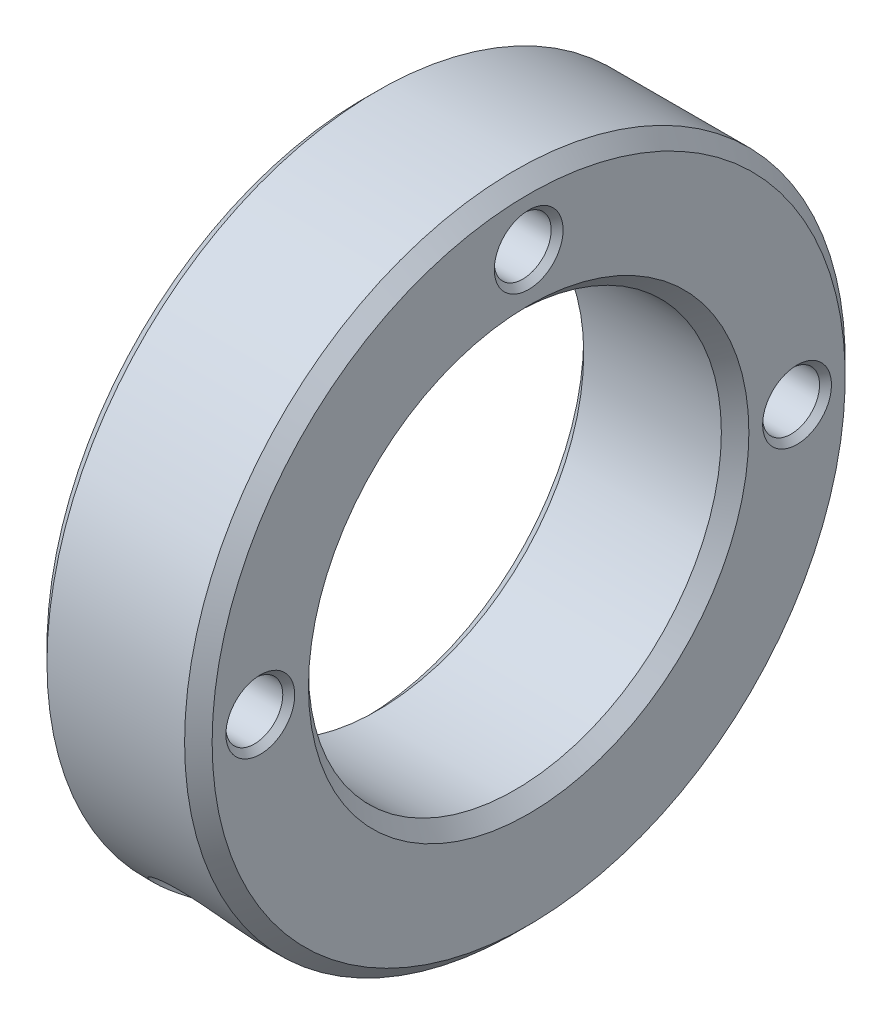
ISO-10303-21;
HEADER;
FILE_DESCRIPTION(('STEP AP214'),'2;1');
FILE_NAME('part.step','',(''),(''),'','','');
FILE_SCHEMA(('AUTOMOTIVE_DESIGN { 1 0 10303 214 1 1 1 1 }'));
ENDSEC;
DATA;
#1=APPLICATION_CONTEXT('core data for automotive mechanical design processes');
#2=APPLICATION_PROTOCOL_DEFINITION('international standard','automotive_design',2000,#1);
#3=PRODUCT_CONTEXT('',#1,'mechanical');
#4=PRODUCT('Part','Part','',(#3));
#5=PRODUCT_RELATED_PRODUCT_CATEGORY('part','',(#4));
#6=PRODUCT_DEFINITION_FORMATION('','',#4);
#7=PRODUCT_DEFINITION_CONTEXT('part definition',#1,'design');
#8=PRODUCT_DEFINITION('design','',#6,#7);
#9=PRODUCT_DEFINITION_SHAPE('','',#8);
#10=(LENGTH_UNIT() NAMED_UNIT(*) SI_UNIT(.MILLI.,.METRE.));
#11=(NAMED_UNIT(*) PLANE_ANGLE_UNIT() SI_UNIT($,.RADIAN.));
#12=(NAMED_UNIT(*) SI_UNIT($,.STERADIAN.) SOLID_ANGLE_UNIT());
#13=UNCERTAINTY_MEASURE_WITH_UNIT(LENGTH_MEASURE(1.E-05),#10,'distance_accuracy_value','');
#14=(GEOMETRIC_REPRESENTATION_CONTEXT(3) GLOBAL_UNCERTAINTY_ASSIGNED_CONTEXT((#13)) GLOBAL_UNIT_ASSIGNED_CONTEXT((#10,
#11,#12)) REPRESENTATION_CONTEXT('',''));
#15=CARTESIAN_POINT('',(0.,0.,0.));
#16=DIRECTION('',(0.,0.,1.));
#17=DIRECTION('',(1.,0.,0.));
#18=AXIS2_PLACEMENT_3D('',#15,#16,#17);
#19=CARTESIAN_POINT('',(0.,-18.5,-24.));
#20=DIRECTION('',(0.,0.,1.));
#21=DIRECTION('',(1.,0.,0.));
#22=AXIS2_PLACEMENT_3D('',#19,#20,#21);
#23=CYLINDRICAL_SURFACE('',#22,2.067);
#24=CARTESIAN_POINT('',(0.,-18.5,2.5));
#25=DIRECTION('',(0.,0.,1.));
#26=DIRECTION('',(1.,0.,0.));
#27=AXIS2_PLACEMENT_3D('',#24,#25,#26);
#28=CIRCLE('',#27,2.067);
#29=CARTESIAN_POINT('',(2.067,-18.5,2.5));
#30=VERTEX_POINT('',#29);
#31=EDGE_CURVE('E20',#30,#30,#28,.F.);
#32=ORIENTED_EDGE('',*,*,#31,.F.);
#33=EDGE_LOOP('',(#32));
#34=FACE_BOUND('',#33,.T.);
#35=CARTESIAN_POINT('',(0.,-18.5,-13.983));
#36=DIRECTION('',(0.,0.,1.));
#37=DIRECTION('',(1.,0.,0.));
#38=AXIS2_PLACEMENT_3D('',#35,#36,#37);
#39=CIRCLE('',#38,2.067);
#40=CARTESIAN_POINT('',(2.067,-18.5,-13.983));
#41=VERTEX_POINT('',#40);
#42=EDGE_CURVE('E237',#41,#41,#39,.F.);
#43=ORIENTED_EDGE('',*,*,#42,.T.);
#44=EDGE_LOOP('',(#43));
#45=FACE_BOUND('',#44,.T.);
#46=ADVANCED_FACE('F17',(#34,#45),#23,.F.);
#47=CARTESIAN_POINT('',(0.,-15.75,2.5));
#48=DIRECTION('',(0.,0.,1.));
#49=DIRECTION('',(1.,0.,0.));
#50=AXIS2_PLACEMENT_3D('',#47,#48,#49);
#51=PLANE('',#50);
#52=ORIENTED_EDGE('',*,*,#31,.T.);
#53=EDGE_LOOP('',(#52));
#54=FACE_BOUND('',#53,.T.);
#55=CARTESIAN_POINT('',(0.,-18.5,2.5));
#56=DIRECTION('',(0.,0.,1.));
#57=DIRECTION('',(1.,0.,0.));
#58=AXIS2_PLACEMENT_3D('',#55,#56,#57);
#59=CIRCLE('',#58,2.75);
#60=CARTESIAN_POINT('',(2.75,-18.5,2.5));
#61=VERTEX_POINT('',#60);
#62=EDGE_CURVE('E235',#61,#61,#59,.T.);
#63=ORIENTED_EDGE('',*,*,#62,.T.);
#64=EDGE_LOOP('',(#63));
#65=FACE_BOUND('',#64,.T.);
#66=ADVANCED_FACE('F244',(#54,#65),#51,.T.);
#67=CARTESIAN_POINT('',(-4.5,-17.5,-13.983));
#68=DIRECTION('',(0.,0.,1.));
#69=DIRECTION('',(1.,0.,0.));
#70=AXIS2_PLACEMENT_3D('',#67,#68,#69);
#71=PLANE('',#70);
#72=ORIENTED_EDGE('',*,*,#42,.F.);
#73=EDGE_LOOP('',(#72));
#74=FACE_BOUND('',#73,.T.);
#75=CARTESIAN_POINT('',(0.,-17.5,-13.983));
#76=DIRECTION('',(0.,0.,1.));
#77=DIRECTION('',(1.,0.,0.));
#78=AXIS2_PLACEMENT_3D('',#75,#76,#77);
#79=CIRCLE('',#78,4.5);
#80=CARTESIAN_POINT('',(-4.02825273579107,-19.5057866029545,-13.983));
#81=VERTEX_POINT('',#80);
#82=CARTESIAN_POINT('',(4.02825273579106,-19.5057866029545,-13.983));
#83=VERTEX_POINT('',#82);
#84=EDGE_CURVE('E43',#81,#83,#79,.F.);
#85=ORIENTED_EDGE('',*,*,#84,.T.);
#86=CARTESIAN_POINT('',(0.,-17.5,-13.983));
#87=DIRECTION('',(0.,0.,1.));
#88=DIRECTION('',(1.,0.,0.));
#89=AXIS2_PLACEMENT_3D('',#86,#87,#88);
#90=CIRCLE('',#89,4.5);
#91=EDGE_CURVE('E49',#81,#83,#90,.T.);
#92=ORIENTED_EDGE('',*,*,#91,.F.);
#93=EDGE_LOOP('',(#85,#92));
#94=FACE_BOUND('',#93,.T.);
#95=ADVANCED_FACE('F56',(#74,#94),#71,.F.);
#96=CARTESIAN_POINT('',(0.,-18.5,-24.));
#97=DIRECTION('',(0.,0.,1.));
#98=DIRECTION('',(1.,0.,0.));
#99=AXIS2_PLACEMENT_3D('',#96,#97,#98);
#100=CYLINDRICAL_SURFACE('',#99,2.75);
#101=CARTESIAN_POINT('',(0.,-18.5,8.));
#102=DIRECTION('',(0.,0.,1.));
#103=DIRECTION('',(1.,0.,0.));
#104=AXIS2_PLACEMENT_3D('',#101,#102,#103);
#105=CIRCLE('',#104,2.75);
#106=CARTESIAN_POINT('',(2.75,-18.5,8.));
#107=VERTEX_POINT('',#106);
#108=EDGE_CURVE('E229',#107,#107,#105,.F.);
#109=ORIENTED_EDGE('',*,*,#108,.F.);
#110=EDGE_LOOP('',(#109));
#111=FACE_BOUND('',#110,.T.);
#112=ORIENTED_EDGE('',*,*,#62,.F.);
#113=EDGE_LOOP('',(#112));
#114=FACE_BOUND('',#113,.T.);
#115=ADVANCED_FACE('F254',(#111,#114),#100,.F.);
#116=CARTESIAN_POINT('',(-6.,0.,0.));
#117=DIRECTION('',(1.,0.,0.));
#118=DIRECTION('',(0.,0.,-1.));
#119=AXIS2_PLACEMENT_3D('',#116,#117,#118);
#120=PLANE('',#119);
#121=CARTESIAN_POINT('',(-6.00000000002865,0.,0.));
#122=DIRECTION('',(-1.,0.,0.));
#123=DIRECTION('',(0.,0.,1.));
#124=AXIS2_PLACEMENT_3D('',#121,#122,#123);
#125=CIRCLE('',#124,16.0000000000196);
#126=CARTESIAN_POINT('',(-6.00000000002865,0.,16.0000000000196));
#127=VERTEX_POINT('',#126);
#128=EDGE_CURVE('E224',#127,#127,#125,.F.);
#129=ORIENTED_EDGE('',*,*,#128,.T.);
#130=EDGE_LOOP('',(#129));
#131=FACE_BOUND('',#130,.T.);
#132=CARTESIAN_POINT('',(-5.99999999997181,0.,19.5));
#133=DIRECTION('',(-1.,0.,0.));
#134=DIRECTION('',(0.,0.,1.));
#135=AXIS2_PLACEMENT_3D('',#132,#133,#134);
#136=CIRCLE('',#135,2.49999999999136);
#137=CARTESIAN_POINT('',(-5.99999999997181,0.,21.9999999999914));
#138=VERTEX_POINT('',#137);
#139=EDGE_CURVE('E68',#138,#138,#136,.F.);
#140=ORIENTED_EDGE('',*,*,#139,.T.);
#141=EDGE_LOOP('',(#140));
#142=FACE_BOUND('',#141,.T.);
#143=CARTESIAN_POINT('',(-6.00000000002865,0.,-19.5));
#144=DIRECTION('',(-1.,0.,0.));
#145=DIRECTION('',(0.,-1.,0.));
#146=AXIS2_PLACEMENT_3D('',#143,#144,#145);
#147=CIRCLE('',#146,2.50000000000409);
#148=CARTESIAN_POINT('',(-6.00000000002865,-2.50000000000409,-19.5));
#149=VERTEX_POINT('',#148);
#150=EDGE_CURVE('E218',#149,#149,#147,.F.);
#151=ORIENTED_EDGE('',*,*,#150,.T.);
#152=EDGE_LOOP('',(#151));
#153=FACE_BOUND('',#152,.T.);
#154=CARTESIAN_POINT('',(-6.00000000002865,19.5,0.));
#155=DIRECTION('',(-1.,0.,0.));
#156=DIRECTION('',(0.,0.,1.));
#157=AXIS2_PLACEMENT_3D('',#154,#155,#156);
#158=CIRCLE('',#157,2.49999999994088);
#159=CARTESIAN_POINT('',(-6.00000000002865,19.5,2.49999999994088));
#160=VERTEX_POINT('',#159);
#161=EDGE_CURVE('E220',#160,#160,#158,.F.);
#162=ORIENTED_EDGE('',*,*,#161,.T.);
#163=EDGE_LOOP('',(#162));
#164=FACE_BOUND('',#163,.T.);
#165=CARTESIAN_POINT('',(-6.00000000002865,0.,0.));
#166=DIRECTION('',(1.,0.,0.));
#167=DIRECTION('',(0.,0.,-1.));
#168=AXIS2_PLACEMENT_3D('',#165,#166,#167);
#169=CIRCLE('',#168,22.9999999999677);
#170=CARTESIAN_POINT('',(-6.00000000002865,0.,-22.9999999999677));
#171=VERTEX_POINT('',#170);
#172=EDGE_CURVE('E57',#171,#171,#169,.T.);
#173=ORIENTED_EDGE('',*,*,#172,.F.);
#174=EDGE_LOOP('',(#173));
#175=FACE_BOUND('',#174,.T.);
#176=ADVANCED_FACE('F260',(#131,#142,#153,#164,#175),#120,.F.);
#177=CARTESIAN_POINT('',(-4.99999999999545,0.,0.));
#178=DIRECTION('',(1.,0.,0.));
#179=DIRECTION('',(0.,0.,-1.));
#180=AXIS2_PLACEMENT_3D('',#177,#178,#179);
#181=CONICAL_SURFACE('',#180,24.0000000000009,0.785398163397448);
#182=CARTESIAN_POINT('',(-5.00000000000001,0.,0.));
#183=DIRECTION('',(-1.,0.,0.));
#184=DIRECTION('',(0.,0.,1.));
#185=AXIS2_PLACEMENT_3D('',#182,#183,#184);
#186=CIRCLE('',#185,24.);
#187=CARTESIAN_POINT('',(-5.00000000000001,0.,24.));
#188=VERTEX_POINT('',#187);
#189=EDGE_CURVE('E65',#188,#188,#186,.F.);
#190=ORIENTED_EDGE('',*,*,#189,.F.);
#191=EDGE_LOOP('',(#190));
#192=FACE_BOUND('',#191,.T.);
#193=ORIENTED_EDGE('',*,*,#172,.T.);
#194=EDGE_LOOP('',(#193));
#195=FACE_BOUND('',#194,.T.);
#196=ADVANCED_FACE('F116',(#192,#195),#181,.T.);
#197=CARTESIAN_POINT('',(0.,-17.5,-24.));
#198=DIRECTION('',(0.,0.,1.));
#199=DIRECTION('',(1.,0.,0.));
#200=AXIS2_PLACEMENT_3D('',#197,#198,#199);
#201=CYLINDRICAL_SURFACE('',#200,4.5);
#202=ORIENTED_EDGE('',*,*,#84,.F.);
#203=CARTESIAN_POINT('',(4.02825273579107,-19.5057866029545,-13.983));
#204=CARTESIAN_POINT('',(4.07011813870699,-19.4216916891278,-14.1003106398066));
#205=CARTESIAN_POINT('',(4.10944999663609,-19.3361176489693,-14.2174465655968));
#206=CARTESIAN_POINT('',(4.18288852756452,-19.162042125413,-14.4512069428515));
#207=CARTESIAN_POINT('',(4.21699443875564,-19.0735402174899,-14.5678313173426));
#208=CARTESIAN_POINT('',(4.31136293833719,-18.803313630925,-14.9171762712155));
#209=CARTESIAN_POINT('',(4.36348259929218,-18.6172543928096,-15.14882865622));
#210=CARTESIAN_POINT('',(4.44442831561673,-18.2322619487699,-15.6101238362541));
#211=CARTESIAN_POINT('',(4.47297500017134,-18.0332036910374,-15.839711498794));
#212=CARTESIAN_POINT('',(4.50287387717036,-17.625687073534,-16.2919474982014));
#213=CARTESIAN_POINT('',(4.50425816121626,-17.417240098279,-16.5146037136643));
#214=CARTESIAN_POINT('',(4.4817259855441,-17.0741330612457,-16.8674061455394));
#215=CARTESIAN_POINT('',(4.46727699489098,-16.9417199872318,-17.0003856111787));
#216=CARTESIAN_POINT('',(4.42575392879518,-16.6748057662755,-17.262264552873));
#217=CARTESIAN_POINT('',(4.39867993000968,-16.5403046320163,-17.391164053696));
#218=CARTESIAN_POINT('',(4.33104851145731,-16.2706678048351,-17.6436770102474));
#219=CARTESIAN_POINT('',(4.29054205966314,-16.1355363858623,-17.7673084837007));
#220=CARTESIAN_POINT('',(4.19507348974543,-15.8654089723527,-18.0089335793862));
#221=CARTESIAN_POINT('',(4.14011445537604,-15.7304129550859,-18.1269283979752));
#222=CARTESIAN_POINT('',(3.97680596757419,-15.3806796853892,-18.4259245678648));
#223=CARTESIAN_POINT('',(3.85626814615783,-15.1670882802348,-18.6018774032465));
#224=CARTESIAN_POINT('',(3.57244561120148,-14.7521428792568,-18.9326348063802));
#225=CARTESIAN_POINT('',(3.4091885716825,-14.5507810646297,-19.0874529669844));
#226=CARTESIAN_POINT('',(3.07081387935731,-14.2032865857724,-19.3469741767358));
#227=CARTESIAN_POINT('',(2.90251689687209,-14.053601538759,-19.4557190780489));
#228=CARTESIAN_POINT('',(2.62903968053641,-13.8460561934639,-19.6034180034844));
#229=CARTESIAN_POINT('',(2.5343334882842,-13.7796817808326,-19.6500967253635));
#230=CARTESIAN_POINT('',(2.3383033230615,-13.6534555586851,-19.7380103086987));
#231=CARTESIAN_POINT('',(2.23698219017744,-13.5936009789897,-19.7792474837734));
#232=CARTESIAN_POINT('',(2.02757809335213,-13.4809005363243,-19.8562336915708));
#233=CARTESIAN_POINT('',(1.91945549985072,-13.4281026994945,-19.8919453550326));
#234=CARTESIAN_POINT('',(1.69781755424645,-13.3308211778975,-19.9572703577973));
#235=CARTESIAN_POINT('',(1.5843047722134,-13.286333579711,-19.9868865682151));
#236=CARTESIAN_POINT('',(1.35272572533296,-13.2063841364712,-20.0398033774951));
#237=CARTESIAN_POINT('',(1.23465989949203,-13.1709214237278,-20.0631045835222));
#238=CARTESIAN_POINT('',(0.99497844575102,-13.1096340497844,-20.1032047317025));
#239=CARTESIAN_POINT('',(0.87336322192613,-13.0838082960603,-20.1200044109299));
#240=CARTESIAN_POINT('',(0.64083179605266,-13.0444731916615,-20.1455256894833));
#241=CARTESIAN_POINT('',(0.53016047764024,-13.0299428607053,-20.1549185143087));
#242=CARTESIAN_POINT('',(0.307680140645444,-13.0091407186338,-20.1683517691437));
#243=CARTESIAN_POINT('',(0.195870763357868,-13.0028715980554,-20.1723904554031));
#244=CARTESIAN_POINT('',(-0.0278888797589654,-12.9986962000824,-20.1750812378676));
#245=CARTESIAN_POINT('',(-0.139838991182545,-13.0007840437977,-20.1737371207237));
#246=CARTESIAN_POINT('',(-0.363121477895706,-13.0132807924288,-20.165678228299));
#247=CARTESIAN_POINT('',(-0.474453612653122,-13.0236927359657,-20.1589614918023));
#248=CARTESIAN_POINT('',(-0.690326324794697,-13.0519968907791,-20.1406465885055));
#249=CARTESIAN_POINT('',(-0.794938029280968,-13.0695096749547,-20.1292958499233));
#250=CARTESIAN_POINT('',(-1.00210072922165,-13.1117233079617,-20.1018244364459));
#251=CARTESIAN_POINT('',(-1.1046509974372,-13.1364266475188,-20.0857021086945));
#252=CARTESIAN_POINT('',(-1.30694258653159,-13.1926900994289,-20.0487919266413));
#253=CARTESIAN_POINT('',(-1.40668505731393,-13.2242473572904,-20.0280060144912));
#254=CARTESIAN_POINT('',(-1.60283577363664,-13.2938434017899,-19.9818785453829));
#255=CARTESIAN_POINT('',(-1.69924274924112,-13.3318846251242,-19.9565352755565));
#256=CARTESIAN_POINT('',(-1.89071321223364,-13.4151023652361,-19.9006935359586));
#257=CARTESIAN_POINT('',(-1.98566961538161,-13.4604442128365,-19.8700740454965));
#258=CARTESIAN_POINT('',(-2.17098775276303,-13.5569371982566,-19.8043648502601));
#259=CARTESIAN_POINT('',(-2.26134781154886,-13.6080904327683,-19.7692735315345));
#260=CARTESIAN_POINT('',(-2.52485414995248,-13.7693915593034,-19.6575917745427));
#261=CARTESIAN_POINT('',(-2.69056012343706,-13.887439908661,-19.5745544418688));
#262=CARTESIAN_POINT('',(-3.01432860231376,-14.1516248686275,-19.3845402143512));
#263=CARTESIAN_POINT('',(-3.17016254214453,-14.2993654769368,-19.2760370290251));
#264=CARTESIAN_POINT('',(-3.45422355132837,-14.6082204772624,-19.0430375194017));
#265=CARTESIAN_POINT('',(-3.58243437481631,-14.7693426625777,-18.9185318519769));
#266=CARTESIAN_POINT('',(-3.77976326327853,-15.0536766566846,-18.6925152977248));
#267=CARTESIAN_POINT('',(-3.85540702812713,-15.1750032901116,-18.5942091848716));
#268=CARTESIAN_POINT('',(-3.99303520597937,-15.4202317337854,-18.3913500757074));
#269=CARTESIAN_POINT('',(-4.05501494891333,-15.544134408684,-18.286794959092));
#270=CARTESIAN_POINT('',(-4.16599586903558,-15.793218844919,-18.0721144186884));
#271=CARTESIAN_POINT('',(-4.21497847233754,-15.9184021740843,-17.9619812881333));
#272=CARTESIAN_POINT('',(-4.30061147602152,-16.1687422108475,-17.7369705904863));
#273=CARTESIAN_POINT('',(-4.33725862361571,-16.2938989027401,-17.6220917809384));
#274=CARTESIAN_POINT('',(-4.4099514518136,-16.5875169522936,-17.3466963761164));
#275=CARTESIAN_POINT('',(-4.4411613130392,-16.7555720183741,-17.1844611549564));
#276=CARTESIAN_POINT('',(-4.48424613791324,-17.0880967792067,-16.8538420102782));
#277=CARTESIAN_POINT('',(-4.49611330686916,-17.2525650022102,-16.6854556359089));
#278=CARTESIAN_POINT('',(-4.50227021785342,-17.5768653257396,-16.3434829363475));
#279=CARTESIAN_POINT('',(-4.49653070474687,-17.7366892641776,-16.1698884316775));
#280=CARTESIAN_POINT('',(-4.46897863640376,-18.0504843217431,-15.8188315604269));
#281=CARTESIAN_POINT('',(-4.4471698315278,-18.204456797709,-15.641370105718));
#282=CARTESIAN_POINT('',(-4.39815667322201,-18.4576564649505,-15.340802894429));
#283=CARTESIAN_POINT('',(-4.37491726235656,-18.5586237141149,-15.2184911198852));
#284=CARTESIAN_POINT('',(-4.32197055428419,-18.757438095382,-14.9727581260719));
#285=CARTESIAN_POINT('',(-4.29226406349738,-18.8552856147606,-14.8493370469666));
#286=CARTESIAN_POINT('',(-4.22688719778346,-19.0471378772981,-14.6024251161482));
#287=CARTESIAN_POINT('',(-4.19125628017337,-19.1411632356438,-14.4789397849601));
#288=CARTESIAN_POINT('',(-4.11411262141721,-19.3259461384139,-14.2313631811294));
#289=CARTESIAN_POINT('',(-4.07259993265165,-19.4167037119307,-14.1072719138925));
#290=CARTESIAN_POINT('',(-4.02825273579107,-19.5057866029545,-13.983));
#291=B_SPLINE_CURVE_WITH_KNOTS('',3,(#203,#204,#205,#206,#207,#208,#209,#210,#211,#212,#213,
#214,#215,#216,#217,#218,#219,#220,#221,#222,#223,#224,#225,#226,#227,#228,#229,#230,#231,#232,
#233,#234,#235,#236,#237,#238,#239,#240,#241,#242,#243,#244,#245,#246,#247,#248,#249,#250,#251,
#252,#253,#254,#255,#256,#257,#258,#259,#260,#261,#262,#263,#264,#265,#266,#267,#268,#269,#270,
#271,#272,#273,#274,#275,#276,#277,#278,#279,#280,#281,#282,#283,#284,#285,#286,#287,#288,#289,
#290),.UNSPECIFIED.,.F.,.F.,(4,2,2,2,2,2,2,2,2,2,2,2,2,2,2,2,2,2,2,2,2,2,2,2,2,2,2,2,2,2,2,2,2,
2,2,2,2,2,2,2,2,2,2,4),(0.,0.450802916319334,0.901671485682042,1.80547749158785,
2.71984700216157,3.63313614610604,4.19737610086185,4.76161262968012,5.32373226495198,
5.88573205768036,6.78758958510447,7.68886431861853,8.43577218482503,8.80952334908758,
9.18311508751647,9.55913232344063,9.93497203818708,10.3107756044712,10.686536553647,
11.0221572154472,11.357887156243,11.6933809619624,12.0289972919512,12.3486471832802,
12.6684079296864,12.9880357579562,13.3077839693565,13.6361911960495,13.9647172874271,
14.6213209634184,15.3404183566864,16.0599375220914,16.5798196011355,17.0998790902056,
17.6206778286187,18.1416137912367,18.8475571849137,19.5537849884543,20.2611868902222,
20.9684237459972,21.4491568320071,21.9298300067433,22.4074214424457,22.8850086251917),.UNSPECIFIED.);
#292=EDGE_CURVE('E62',#83,#81,#291,.T.);
#293=ORIENTED_EDGE('',*,*,#292,.F.);
#294=EDGE_LOOP('',(#202,#293));
#295=FACE_BOUND('',#294,.T.);
#296=ADVANCED_FACE('F64',(#295),#201,.F.);
#297=CARTESIAN_POINT('',(0.,-17.5,-13.983));
#298=DIRECTION('',(0.,0.,1.));
#299=DIRECTION('',(1.,0.,0.));
#300=AXIS2_PLACEMENT_3D('',#297,#298,#299);
#301=CYLINDRICAL_SURFACE('',#300,4.5);
#302=ORIENTED_EDGE('',*,*,#91,.T.);
#303=CARTESIAN_POINT('',(-4.02825273579106,-19.5057866029545,-13.983));
#304=CARTESIAN_POINT('',(-3.98529466328029,-19.5920369101565,-13.8626881932313));
#305=CARTESIAN_POINT('',(-3.9396819493826,-19.6767207505555,-13.742202286555));
#306=CARTESIAN_POINT('',(-3.84318348071561,-19.8429037592596,-13.5011322854667));
#307=CARTESIAN_POINT('',(-3.79229736491206,-19.92440270899,-13.3805481848934));
#308=CARTESIAN_POINT('',(-3.68503511206854,-20.0845392145347,-13.1389647578401));
#309=CARTESIAN_POINT('',(-3.62863357934604,-20.1631610003398,-13.0179662488333));
#310=CARTESIAN_POINT('',(-3.51049738654812,-20.3170587994256,-12.7764479713773));
#311=CARTESIAN_POINT('',(-3.44876282174438,-20.3923348724394,-12.655928194416));
#312=CARTESIAN_POINT('',(-3.31560659930782,-20.5442759083226,-12.4078700443909));
#313=CARTESIAN_POINT('',(-3.24381548596653,-20.6207099021371,-12.2803879665362));
#314=CARTESIAN_POINT('',(-3.09372461237046,-20.7695628232384,-12.0269221216094));
#315=CARTESIAN_POINT('',(-3.01542522312974,-20.8419819790051,-11.9009382695962));
#316=CARTESIAN_POINT('',(-2.85199730958636,-20.9824852424979,-11.6514276781569));
#317=CARTESIAN_POINT('',(-2.76688293992991,-21.0505778343178,-11.5278964784451));
#318=CARTESIAN_POINT('',(-2.58900659806095,-21.1822948499463,-11.2840404155974));
#319=CARTESIAN_POINT('',(-2.49624737368776,-21.2459208641098,-11.1637144207938));
#320=CARTESIAN_POINT('',(-2.31302549066055,-21.3613824180564,-10.9409894269578));
#321=CARTESIAN_POINT('',(-2.22348880108832,-21.4137376966827,-10.8381016357787));
#322=CARTESIAN_POINT('',(-2.0365567069352,-21.5141884066184,-10.6373066367917));
#323=CARTESIAN_POINT('',(-1.93915645719566,-21.5622811726929,-10.5394025612251));
#324=CARTESIAN_POINT('',(-1.7367483876763,-21.6528101698302,-10.3521240120024));
#325=CARTESIAN_POINT('',(-1.63186510440489,-21.6953157232446,-10.2626499083642));
#326=CARTESIAN_POINT('',(-1.41212826946205,-21.7742831099727,-10.0940192050987));
#327=CARTESIAN_POINT('',(-1.29729344509711,-21.8107559351273,-10.0148438982256));
#328=CARTESIAN_POINT('',(-1.07879215697845,-21.8699560669577,-9.88479433364283));
#329=CARTESIAN_POINT('',(-0.977006324633257,-21.893978134158,-9.83139470307719));
#330=CARTESIAN_POINT('',(-0.766040194860701,-21.9356191866037,-9.73813259561615));
#331=CARTESIAN_POINT('',(-0.656862465705744,-21.9532403823881,-9.69826544559498));
#332=CARTESIAN_POINT('',(-0.431186790476799,-21.9807480604876,-9.63576311784391));
#333=CARTESIAN_POINT('',(-0.314619294451143,-21.9905435908753,-9.61333064963132));
#334=CARTESIAN_POINT('',(-0.0789367671910107,-22.0008474977952,-9.58972926350959));
#335=CARTESIAN_POINT('',(0.0401759672003924,-22.0013639206377,-9.58854192304689));
#336=CARTESIAN_POINT('',(0.262482825084034,-21.9935554102551,-9.6064335801814));
#337=CARTESIAN_POINT('',(0.365916521134155,-21.9862522445815,-9.62317050974391));
#338=CARTESIAN_POINT('',(0.568563392372848,-21.9651022518871,-9.67134782937783));
#339=CARTESIAN_POINT('',(0.667773518544771,-21.9512507820907,-9.70279865149734));
#340=CARTESIAN_POINT('',(0.908567986942489,-21.9097611868066,-9.79622713709595));
#341=CARTESIAN_POINT('',(1.04664963881101,-21.8786925267916,-9.86560723021787));
#342=CARTESIAN_POINT('',(1.30967716131362,-21.8073724471969,-10.0222716689717));
#343=CARTESIAN_POINT('',(1.43458033664017,-21.7670924439046,-10.1096116590732));
#344=CARTESIAN_POINT('',(1.66450587970079,-21.6825076335831,-10.2897093125546));
#345=CARTESIAN_POINT('',(1.77029950527411,-21.638653107964,-10.3817122812517));
#346=CARTESIAN_POINT('',(1.97302000490911,-21.5459396771384,-10.5727847541814));
#347=CARTESIAN_POINT('',(2.06993881265777,-21.4970763032167,-10.671860544188));
#348=CARTESIAN_POINT('',(2.25650591596424,-21.3948104314378,-10.8754374954069));
#349=CARTESIAN_POINT('',(2.3461137720146,-21.3413856454812,-10.9799641959953));
#350=CARTESIAN_POINT('',(2.51842688812065,-21.2306843604951,-11.19251548961));
#351=CARTESIAN_POINT('',(2.60113405709657,-21.1734089346282,-11.3005391037402));
#352=CARTESIAN_POINT('',(2.75668594165557,-21.0580353465823,-11.5140427904745));
#353=CARTESIAN_POINT('',(2.82981042981611,-21.000099291298,-11.6194075565421));
#354=CARTESIAN_POINT('',(2.9709155507864,-20.8811490037006,-11.8318406247146));
#355=CARTESIAN_POINT('',(3.0388953864374,-20.8201342967849,-11.9389091877231));
#356=CARTESIAN_POINT('',(3.23574494835646,-20.6325535438011,-12.2621266007266));
#357=CARTESIAN_POINT('',(3.35740709232816,-20.5015393930031,-12.4801225173301));
#358=CARTESIAN_POINT('',(3.57998261979675,-20.2319279684081,-12.912488198477));
#359=CARTESIAN_POINT('',(3.68135681749275,-20.0936200205307,-13.1268029410246));
#360=CARTESIAN_POINT('',(3.82089562966145,-19.8786599560424,-13.4482513177323));
#361=CARTESIAN_POINT('',(3.86528149256534,-19.8058371653326,-13.5552846288738));
#362=CARTESIAN_POINT('',(3.94989413600819,-19.6576849751277,-13.7692541644965));
#363=CARTESIAN_POINT('',(3.99012106072883,-19.5823556626482,-13.8761903922159));
#364=CARTESIAN_POINT('',(4.02825273579106,-19.5057866029545,-13.983));
#365=B_SPLINE_CURVE_WITH_KNOTS('',3,(#303,#304,#305,#306,#307,#308,#309,#310,#311,#312,#313,
#314,#315,#316,#317,#318,#319,#320,#321,#322,#323,#324,#325,#326,#327,#328,#329,#330,#331,#332,
#333,#334,#335,#336,#337,#338,#339,#340,#341,#342,#343,#344,#345,#346,#347,#348,#349,#350,#351,
#352,#353,#354,#355,#356,#357,#358,#359,#360,#361,#362,#363,#364),.UNSPECIFIED.,.F.,.F.,(4,2,2,
2,2,2,2,2,2,2,2,2,2,2,2,2,2,2,2,2,2,2,2,2,2,2,2,2,2,2,4),(0.,0.462390741969725,
0.924813161653511,1.38947518802857,1.85412891518941,2.34916190953326,2.8441667031054,
3.33816879533057,3.83199409318746,4.26998966779366,4.70825720518185,5.14043398871707,
5.57181444360907,5.92316192373352,6.27438795049141,6.62963893650937,6.98458185434937,
7.29822444681544,7.61208974749106,8.08226298099197,8.5539154970583,8.993977175421,
9.43443493571664,9.87718372330294,10.3198096254741,10.7418530009181,11.1639616382318,
12.008839437506,12.8315396617852,13.2420300300843,13.6525061627655),.UNSPECIFIED.);
#366=EDGE_CURVE('E52',#81,#83,#365,.T.);
#367=ORIENTED_EDGE('',*,*,#366,.F.);
#368=EDGE_LOOP('',(#302,#367));
#369=FACE_BOUND('',#368,.T.);
#370=ADVANCED_FACE('F50',(#369),#301,.T.);
#371=CARTESIAN_POINT('',(0.,-18.5,-24.));
#372=DIRECTION('',(0.,0.,1.));
#373=DIRECTION('',(1.,0.,0.));
#374=AXIS2_PLACEMENT_3D('',#371,#372,#373);
#375=CYLINDRICAL_SURFACE('',#374,4.5);
#376=CARTESIAN_POINT('',(-1.79288285308112,-22.6274169979695,8.00000000000001));
#377=CARTESIAN_POINT('',(-1.83603867823033,-22.6086671886794,8.05303442126197));
#378=CARTESIAN_POINT('',(-1.87830582189091,-22.5895062877717,8.10663429254327));
#379=CARTESIAN_POINT('',(-1.96121211806727,-22.5504016963955,8.21478437087046));
#380=CARTESIAN_POINT('',(-2.00185154953945,-22.5304581412278,8.26933441275741));
#381=CARTESIAN_POINT('',(-2.12151566089538,-22.4695323847225,8.43408638560392));
#382=CARTESIAN_POINT('',(-2.19834881507633,-22.4274275637272,8.54546823046764));
#383=CARTESIAN_POINT('',(-2.34689027709392,-22.3405066304123,8.77019138772941));
#384=CARTESIAN_POINT('',(-2.41860843860595,-22.2956960561125,8.88352837988739));
#385=CARTESIAN_POINT('',(-2.55770591737161,-22.2033902500079,9.11178539694749));
#386=CARTESIAN_POINT('',(-2.62508429968053,-22.1558944438185,9.22670575653357));
#387=CARTESIAN_POINT('',(-2.82201010801881,-22.0090212685831,9.57425589805922));
#388=CARTESIAN_POINT('',(-2.94564356467706,-21.9056773174459,9.8085852475051));
#389=CARTESIAN_POINT('',(-3.17923459511534,-21.6887041883807,10.27946844944));
#390=CARTESIAN_POINT('',(-3.28918142231763,-21.5750670478058,10.5160238950345));
#391=CARTESIAN_POINT('',(-3.53477913129127,-21.2932430281923,11.0783678735317));
#392=CARTESIAN_POINT('',(-3.66466556574474,-21.1205490315942,11.4044429491239));
#393=CARTESIAN_POINT('',(-3.89958992385621,-20.7561341558027,12.0549561318497));
#394=CARTESIAN_POINT('',(-4.00462552045223,-20.5644114971271,12.3793940828993));
#395=CARTESIAN_POINT('',(-4.18751150694113,-20.1623687450181,13.0239397782452));
#396=CARTESIAN_POINT('',(-4.26539126051471,-19.9520690494237,13.3440518377201));
#397=CARTESIAN_POINT('',(-4.39034020826012,-19.5133543987682,13.977740789135));
#398=CARTESIAN_POINT('',(-4.43742946451687,-19.284951348272,14.2913218072595));
#399=CARTESIAN_POINT('',(-4.48346132808158,-18.9098562558383,14.7807033308222));
#400=CARTESIAN_POINT('',(-4.49427828066584,-18.768631835713,14.9596297184407));
#401=CARTESIAN_POINT('',(-4.50225926818371,-18.4809921458078,15.313551701186));
#402=CARTESIAN_POINT('',(-4.49942700446748,-18.3345782939705,15.488548349036));
#403=CARTESIAN_POINT('',(-4.47864025193653,-18.0374818984195,15.8335403019591));
#404=CARTESIAN_POINT('',(-4.46070828594025,-17.8868060352639,16.0035426659082));
#405=CARTESIAN_POINT('',(-4.40808595457419,-17.5820216278494,16.3377971985099));
#406=CARTESIAN_POINT('',(-4.37339938063769,-17.4279138677236,16.502050659079));
#407=CARTESIAN_POINT('',(-4.29536799201706,-17.1526254714215,16.7874192351606));
#408=CARTESIAN_POINT('',(-4.25572607436457,-17.0318361145257,16.9099266873602));
#409=CARTESIAN_POINT('',(-4.16443923465171,-16.789985764209,17.1500845400517));
#410=CARTESIAN_POINT('',(-4.11279732563168,-16.6689248465176,17.2677361510634));
#411=CARTESIAN_POINT('',(-3.9966789640794,-16.427692732745,17.4973886846402));
#412=CARTESIAN_POINT('',(-3.93220993277556,-16.3075210636861,17.6093928278429));
#413=CARTESIAN_POINT('',(-3.78968468994452,-16.069455744609,17.8269073844106));
#414=CARTESIAN_POINT('',(-3.71163214855099,-15.9515614887904,17.9324195414512));
#415=CARTESIAN_POINT('',(-3.49548864649269,-15.6573971431009,18.1907089540565));
#416=CARTESIAN_POINT('',(-3.34764329281184,-15.4837139568294,18.338501463834));
#417=CARTESIAN_POINT('',(-3.01725548228883,-15.1532628781821,18.6124883790899));
#418=CARTESIAN_POINT('',(-2.83475449902201,-14.9964751144907,18.7387082616617));
#419=CARTESIAN_POINT('',(-2.46630814542734,-14.7302767509667,18.9484373892969));
#420=CARTESIAN_POINT('',(-2.28502942335573,-14.6172871338608,19.0355168426987));
#421=CARTESIAN_POINT('',(-1.99735234583866,-14.4660961931573,19.1503546736778));
#422=CARTESIAN_POINT('',(-1.89878645088871,-14.4187312483725,19.1860159894857));
#423=CARTESIAN_POINT('',(-1.69692553108699,-14.330762381723,19.2518119410699));
#424=CARTESIAN_POINT('',(-1.59363249187613,-14.2901556537017,19.2819488712195));
#425=CARTESIAN_POINT('',(-1.38239809725067,-14.2161265303943,19.3365942932843));
#426=CARTESIAN_POINT('',(-1.27443480308239,-14.1827437911274,19.3610717654916));
#427=CARTESIAN_POINT('',(-1.05521855241465,-14.1239993250384,19.4039678212127));
#428=CARTESIAN_POINT('',(-0.943967077799671,-14.0986340434889,19.4223890900316));
#429=CARTESIAN_POINT('',(-0.719031126227702,-14.0563426680518,19.4530181280605));
#430=CARTESIAN_POINT('',(-0.605346723382082,-14.0394163174798,19.4652260862591));
#431=CARTESIAN_POINT('',(-0.376521539512119,-14.0143031864248,19.4833146052576));
#432=CARTESIAN_POINT('',(-0.261380879665159,-14.0061156835476,19.489195689067));
#433=CARTESIAN_POINT('',(-0.0409653242424213,-13.9989584112083,19.4943370627028));
#434=CARTESIAN_POINT('',(0.0642733633486204,-13.9992314912818,19.4941411865905));
#435=CARTESIAN_POINT('',(0.27436664666437,-14.0071417128206,19.488458264392));
#436=CARTESIAN_POINT('',(0.379221106789382,-14.0147812419453,19.4829695027428));
#437=CARTESIAN_POINT('',(0.587674159898121,-14.0373076305045,19.4667456445954));
#438=CARTESIAN_POINT('',(0.691273447608426,-14.0521902737016,19.4560136002131));
#439=CARTESIAN_POINT('',(0.896577853468668,-14.0889876686893,19.429383453397));
#440=CARTESIAN_POINT('',(0.998282246618583,-14.1109050558472,19.4134834148924));
#441=CARTESIAN_POINT('',(1.19747481059653,-14.1610565746156,19.3769301670722));
#442=CARTESIAN_POINT('',(1.29500432178652,-14.1891846266582,19.3563566296365));
#443=CARTESIAN_POINT('',(1.48695203646321,-14.2515678110534,19.3104715409869));
#444=CARTESIAN_POINT('',(1.58136913872458,-14.2858250850537,19.2851583335127));
#445=CARTESIAN_POINT('',(1.85908163089792,-14.3971358005186,19.2023709321453));
#446=CARTESIAN_POINT('',(2.03700512723982,-14.4827710558937,19.1380181450478));
#447=CARTESIAN_POINT('',(2.38652925004451,-14.6793383590636,18.9877137154718));
#448=CARTESIAN_POINT('',(2.55686108412865,-14.791601774798,18.9005841718095));
#449=CARTESIAN_POINT('',(2.87506545865033,-15.0324540999492,18.7095965143679));
#450=CARTESIAN_POINT('',(3.02292579691965,-15.1610518099156,18.6057293745835));
#451=CARTESIAN_POINT('',(3.3513190583122,-15.484805949521,18.3379614664193));
#452=CARTESIAN_POINT('',(3.52042498257269,-15.6856484691569,18.1668977430064));
#453=CARTESIAN_POINT('',(3.81427888525159,-16.0987863589074,17.8018345578965));
#454=CARTESIAN_POINT('',(3.93893999110672,-16.3111032347417,17.6077911547848));
#455=CARTESIAN_POINT('',(4.11470275130599,-16.6708783845115,17.2662294277528));
#456=CARTESIAN_POINT('',(4.17660318547325,-16.817659664569,17.1233539494858));
#457=CARTESIAN_POINT('',(4.28298590956498,-17.1106384704675,16.8305940628658));
#458=CARTESIAN_POINT('',(4.32746197541723,-17.2568357692836,16.6807071713626));
#459=CARTESIAN_POINT('',(4.4005196814939,-17.5471823949118,16.3750082150218));
#460=CARTESIAN_POINT('',(4.42908788931833,-17.6913298911308,16.2191912611433));
#461=CARTESIAN_POINT('',(4.471750298462,-17.976348993307,15.9027122160361));
#462=CARTESIAN_POINT('',(4.48584435932668,-18.1172205674622,15.7420500778061));
#463=CARTESIAN_POINT('',(4.50441125341471,-18.4591551919183,15.3413613336449));
#464=CARTESIAN_POINT('',(4.50141597996137,-18.6579127151334,15.0990059388699));
#465=CARTESIAN_POINT('',(4.47108602341444,-19.0450864497568,14.6076238615064));
#466=CARTESIAN_POINT('',(4.44373963803666,-19.2334976428611,14.3585940272321));
#467=CARTESIAN_POINT('',(4.36763533425731,-19.5994429754751,13.8549261989726));
#468=CARTESIAN_POINT('',(4.3188226977355,-19.7769479882947,13.600275463071));
#469=CARTESIAN_POINT('',(4.20219037056413,-20.1200049439038,13.0874210789804));
#470=CARTESIAN_POINT('',(4.13437367523079,-20.2855587652077,12.8292179967863));
#471=CARTESIAN_POINT('',(3.97811943674076,-20.6115577877484,12.2989740906135));
#472=CARTESIAN_POINT('',(3.88890299639824,-20.7714538294892,12.0268260405989));
#473=CARTESIAN_POINT('',(3.69290336250368,-21.0778979149099,11.4812950792675));
#474=CARTESIAN_POINT('',(3.58611649384634,-21.2244431560953,11.2079119212696));
#475=CARTESIAN_POINT('',(3.35574777289674,-21.5036036832979,10.6624793669022));
#476=CARTESIAN_POINT('',(3.23222786937978,-21.6362672933311,10.390428715763));
#477=CARTESIAN_POINT('',(3.03347714021154,-21.8251068792384,9.98433925736216));
#478=CARTESIAN_POINT('',(2.96498833065424,-21.8863558566273,9.84931891341515));
#479=CARTESIAN_POINT('',(2.8232036241523,-22.0054388221808,9.58030691619238));
#480=CARTESIAN_POINT('',(2.74990828134432,-22.0632732025524,9.44631514631682));
#481=CARTESIAN_POINT('',(2.60957343564937,-22.1669523005227,9.20006874372718));
#482=CARTESIAN_POINT('',(2.54327117625062,-22.2132850817402,9.0875995532354));
#483=CARTESIAN_POINT('',(2.40648170804674,-22.3033595427046,8.86423465357319));
#484=CARTESIAN_POINT('',(2.33599603035421,-22.3471021588731,8.75333838690744));
#485=CARTESIAN_POINT('',(2.19017354745843,-22.4319587768472,8.53352661616763));
#486=CARTESIAN_POINT('',(2.11483141737117,-22.4730697913293,8.42461346017732));
#487=CARTESIAN_POINT('',(1.9583917029495,-22.5524428546141,8.20978497178239));
#488=CARTESIAN_POINT('',(1.87728921051951,-22.590702415568,8.10387230605792));
#489=CARTESIAN_POINT('',(1.79288285308112,-22.6274169979695,8.00000000000001));
#490=B_SPLINE_CURVE_WITH_KNOTS('',3,(#376,#377,#378,#379,#380,#381,#382,#383,#384,#385,#386,
#387,#388,#389,#390,#391,#392,#393,#394,#395,#396,#397,#398,#399,#400,#401,#402,#403,#404,#405,
#406,#407,#408,#409,#410,#411,#412,#413,#414,#415,#416,#417,#418,#419,#420,#421,#422,#423,#424,
#425,#426,#427,#428,#429,#430,#431,#432,#433,#434,#435,#436,#437,#438,#439,#440,#441,#442,#443,
#444,#445,#446,#447,#448,#449,#450,#451,#452,#453,#454,#455,#456,#457,#458,#459,#460,#461,#462,
#463,#464,#465,#466,#467,#468,#469,#470,#471,#472,#473,#474,#475,#476,#477,#478,#479,#480,#481,
#482,#483,#484,#485,#486,#487,#488,#489),.UNSPECIFIED.,.F.,.F.,(4,2,2,2,2,2,2,2,2,2,2,2,2,2,2,2,
2,2,2,2,2,2,2,2,2,2,2,2,2,2,2,2,2,2,2,2,2,2,2,2,2,2,2,2,2,2,2,2,2,2,2,2,2,2,2,2,4),(0.,
0.21267258885271,0.425308572665976,0.850269498671595,1.27438832355228,1.69859821537544,
2.55109948046445,3.40426595289652,4.57649920018433,5.74884217337877,6.9199135292367,
8.09022109079573,8.77440679711482,9.4584069786178,10.1413887043832,10.8242159492212,
11.3534412522981,11.8825338171582,12.4113211570059,12.9399658447953,13.752009184021,
14.5630867788014,15.2518948505816,15.5966036252534,15.941168910408,16.2875802235074,
16.6338377309093,16.9800847056558,17.3263030557798,17.6416354415569,17.9570700692008,
18.2723213006624,18.5876907701668,18.8980412610937,19.2085004059533,19.8288994250889,
20.4918122304177,21.1550837253675,22.0900525287395,23.0268389455754,23.6679905462162,
24.3093709610787,24.9512921316164,25.593219531185,26.5321369686392,27.4715058603004,
28.4132832375968,29.3549122604824,30.3381577530507,31.3216091674686,32.3015143966483,
32.7913813280674,33.2811918825513,33.6967129887,34.1120829427112,34.5279163445081,
34.94410840733),.UNSPECIFIED.);
#491=CARTESIAN_POINT('',(-1.79288285308111,-22.6274169979695,8.));
#492=VERTEX_POINT('',#491);
#493=CARTESIAN_POINT('',(1.79288285308111,-22.6274169979695,8.00000000000001));
#494=VERTEX_POINT('',#493);
#495=EDGE_CURVE('E34',#492,#494,#490,.T.);
#496=ORIENTED_EDGE('',*,*,#495,.F.);
#497=CARTESIAN_POINT('',(0.,-18.5,8.));
#498=DIRECTION('',(0.,0.,1.));
#499=DIRECTION('',(1.,0.,0.));
#500=AXIS2_PLACEMENT_3D('',#497,#498,#499);
#501=CIRCLE('',#500,4.5);
#502=EDGE_CURVE('E54',#494,#492,#501,.T.);
#503=ORIENTED_EDGE('',*,*,#502,.F.);
#504=EDGE_LOOP('',(#496,#503));
#505=FACE_BOUND('',#504,.T.);
#506=ADVANCED_FACE('F103',(#505),#375,.F.);
#507=CARTESIAN_POINT('',(0.,-14.,8.));
#508=DIRECTION('',(0.,0.,1.));
#509=DIRECTION('',(1.,0.,0.));
#510=AXIS2_PLACEMENT_3D('',#507,#508,#509);
#511=PLANE('',#510);
#512=ORIENTED_EDGE('',*,*,#108,.T.);
#513=EDGE_LOOP('',(#512));
#514=FACE_BOUND('',#513,.T.);
#515=DIRECTION('',(-1.,0.,0.));
#516=VECTOR('',#515,1.);
#517=CARTESIAN_POINT('',(6.,-22.6274169979695,7.99999999999999));
#518=LINE('',#517,#516);
#519=EDGE_CURVE('E100',#494,#492,#518,.T.);
#520=ORIENTED_EDGE('',*,*,#519,.F.);
#521=ORIENTED_EDGE('',*,*,#502,.T.);
#522=EDGE_LOOP('',(#520,#521));
#523=FACE_BOUND('',#522,.T.);
#524=ADVANCED_FACE('F107',(#514,#523),#511,.T.);
#525=CARTESIAN_POINT('',(-6.00000000002865,0.,0.));
#526=DIRECTION('',(-1.,0.,0.));
#527=DIRECTION('',(0.,0.,1.));
#528=AXIS2_PLACEMENT_3D('',#525,#526,#527);
#529=CONICAL_SURFACE('',#528,16.0000000000196,0.785398163397448);
#530=ORIENTED_EDGE('',*,*,#128,.F.);
#531=EDGE_LOOP('',(#530));
#532=FACE_BOUND('',#531,.T.);
#533=CARTESIAN_POINT('',(-4.99999999999999,0.,0.));
#534=DIRECTION('',(-1.,0.,0.));
#535=DIRECTION('',(0.,0.,1.));
#536=AXIS2_PLACEMENT_3D('',#533,#534,#535);
#537=CIRCLE('',#536,15.);
#538=CARTESIAN_POINT('',(-4.99999999999999,0.,15.));
#539=VERTEX_POINT('',#538);
#540=EDGE_CURVE('E169',#539,#539,#537,.F.);
#541=ORIENTED_EDGE('',*,*,#540,.T.);
#542=EDGE_LOOP('',(#541));
#543=FACE_BOUND('',#542,.T.);
#544=ADVANCED_FACE('F302',(#532,#543),#529,.F.);
#545=CARTESIAN_POINT('',(-6.00000000002865,19.5,0.));
#546=DIRECTION('',(-1.,0.,0.));
#547=DIRECTION('',(0.,0.,1.));
#548=AXIS2_PLACEMENT_3D('',#545,#546,#547);
#549=CONICAL_SURFACE('',#548,2.49999999994088,0.785398163397448);
#550=CARTESIAN_POINT('',(-5.56700000000001,19.5,0.));
#551=DIRECTION('',(-1.,0.,0.));
#552=DIRECTION('',(0.,0.,1.));
#553=AXIS2_PLACEMENT_3D('',#550,#551,#552);
#554=CIRCLE('',#553,2.067);
#555=CARTESIAN_POINT('',(-5.56700000000001,19.5,2.067));
#556=VERTEX_POINT('',#555);
#557=EDGE_CURVE('E166',#556,#556,#554,.F.);
#558=ORIENTED_EDGE('',*,*,#557,.T.);
#559=EDGE_LOOP('',(#558));
#560=FACE_BOUND('',#559,.T.);
#561=ORIENTED_EDGE('',*,*,#161,.F.);
#562=EDGE_LOOP('',(#561));
#563=FACE_BOUND('',#562,.T.);
#564=ADVANCED_FACE('F213',(#560,#563),#549,.F.);
#565=CARTESIAN_POINT('',(-5.99999999991496,0.,-19.5));
#566=DIRECTION('',(-1.,0.,0.));
#567=DIRECTION('',(0.,-1.,0.));
#568=AXIS2_PLACEMENT_3D('',#565,#566,#567);
#569=CONICAL_SURFACE('',#568,2.49999999989041,0.785398163397448);
#570=ORIENTED_EDGE('',*,*,#150,.F.);
#571=EDGE_LOOP('',(#570));
#572=FACE_BOUND('',#571,.T.);
#573=CARTESIAN_POINT('',(-5.567,0.,-19.5));
#574=DIRECTION('',(-1.,0.,0.));
#575=DIRECTION('',(0.,0.,1.));
#576=AXIS2_PLACEMENT_3D('',#573,#574,#575);
#577=CIRCLE('',#576,2.067);
#578=CARTESIAN_POINT('',(-5.567,0.,-17.433));
#579=VERTEX_POINT('',#578);
#580=EDGE_CURVE('E168',#579,#579,#577,.F.);
#581=ORIENTED_EDGE('',*,*,#580,.T.);
#582=EDGE_LOOP('',(#581));
#583=FACE_BOUND('',#582,.T.);
#584=ADVANCED_FACE('F208',(#572,#583),#569,.F.);
#585=CARTESIAN_POINT('',(-5.99999999985812,0.,19.5));
#586=DIRECTION('',(-1.,0.,0.));
#587=DIRECTION('',(0.,0.,1.));
#588=AXIS2_PLACEMENT_3D('',#585,#586,#587);
#589=CONICAL_SURFACE('',#588,2.49999999987767,0.785398163397448);
#590=ORIENTED_EDGE('',*,*,#139,.F.);
#591=EDGE_LOOP('',(#590));
#592=FACE_BOUND('',#591,.T.);
#593=CARTESIAN_POINT('',(-5.567,0.,19.5));
#594=DIRECTION('',(-1.,0.,0.));
#595=DIRECTION('',(0.,0.,1.));
#596=AXIS2_PLACEMENT_3D('',#593,#594,#595);
#597=CIRCLE('',#596,2.067);
#598=CARTESIAN_POINT('',(-5.567,0.,21.567));
#599=VERTEX_POINT('',#598);
#600=EDGE_CURVE('E172',#599,#599,#597,.F.);
#601=ORIENTED_EDGE('',*,*,#600,.T.);
#602=EDGE_LOOP('',(#601));
#603=FACE_BOUND('',#602,.T.);
#604=ADVANCED_FACE('F89',(#592,#603),#589,.F.);
#605=CARTESIAN_POINT('',(6.,0.,0.));
#606=DIRECTION('',(-1.,0.,0.));
#607=DIRECTION('',(0.,0.,1.));
#608=AXIS2_PLACEMENT_3D('',#605,#606,#607);
#609=CYLINDRICAL_SURFACE('',#608,24.);
#610=ORIENTED_EDGE('',*,*,#189,.T.);
#611=EDGE_LOOP('',(#610));
#612=FACE_BOUND('',#611,.T.);
#613=ORIENTED_EDGE('',*,*,#495,.T.);
#614=ORIENTED_EDGE('',*,*,#519,.T.);
#615=EDGE_LOOP('',(#613,#614));
#616=FACE_BOUND('',#615,.T.);
#617=ORIENTED_EDGE('',*,*,#292,.T.);
#618=ORIENTED_EDGE('',*,*,#366,.T.);
#619=EDGE_LOOP('',(#617,#618));
#620=FACE_BOUND('',#619,.T.);
#621=CARTESIAN_POINT('',(4.99999999999545,0.,0.));
#622=DIRECTION('',(-1.,0.,0.));
#623=DIRECTION('',(0.,0.,1.));
#624=AXIS2_PLACEMENT_3D('',#621,#622,#623);
#625=CIRCLE('',#624,24.0000000000009);
#626=CARTESIAN_POINT('',(4.99999999999545,0.,24.0000000000009));
#627=VERTEX_POINT('',#626);
#628=EDGE_CURVE('E200',#627,#627,#625,.F.);
#629=ORIENTED_EDGE('',*,*,#628,.F.);
#630=EDGE_LOOP('',(#629));
#631=FACE_BOUND('',#630,.T.);
#632=ADVANCED_FACE('F60',(#612,#616,#620,#631),#609,.T.);
#633=CARTESIAN_POINT('',(6.,0.,0.));
#634=DIRECTION('',(-1.,0.,0.));
#635=DIRECTION('',(0.,0.,1.));
#636=AXIS2_PLACEMENT_3D('',#633,#634,#635);
#637=CYLINDRICAL_SURFACE('',#636,15.);
#638=ORIENTED_EDGE('',*,*,#540,.F.);
#639=EDGE_LOOP('',(#638));
#640=FACE_BOUND('',#639,.T.);
#641=CARTESIAN_POINT('',(5.0000000000523,0.,0.));
#642=DIRECTION('',(1.,0.,0.));
#643=DIRECTION('',(0.,0.,-1.));
#644=AXIS2_PLACEMENT_3D('',#641,#642,#643);
#645=CIRCLE('',#644,14.9999999999864);
#646=CARTESIAN_POINT('',(5.0000000000523,0.,-14.9999999999864));
#647=VERTEX_POINT('',#646);
#648=EDGE_CURVE('E197',#647,#647,#645,.T.);
#649=ORIENTED_EDGE('',*,*,#648,.T.);
#650=EDGE_LOOP('',(#649));
#651=FACE_BOUND('',#650,.T.);
#652=ADVANCED_FACE('F88',(#640,#651),#637,.F.);
#653=CARTESIAN_POINT('',(6.,19.5,0.));
#654=DIRECTION('',(-1.,0.,0.));
#655=DIRECTION('',(0.,0.,1.));
#656=AXIS2_PLACEMENT_3D('',#653,#654,#655);
#657=CYLINDRICAL_SURFACE('',#656,2.067);
#658=CARTESIAN_POINT('',(5.566999999985,19.5,0.));
#659=DIRECTION('',(1.,0.,0.));
#660=DIRECTION('',(0.,0.,-1.));
#661=AXIS2_PLACEMENT_3D('',#658,#659,#660);
#662=CIRCLE('',#661,2.06700000001092);
#663=CARTESIAN_POINT('',(5.566999999985,19.5,-2.06700000001092));
#664=VERTEX_POINT('',#663);
#665=EDGE_CURVE('E163',#664,#664,#662,.T.);
#666=ORIENTED_EDGE('',*,*,#665,.T.);
#667=EDGE_LOOP('',(#666));
#668=FACE_BOUND('',#667,.T.);
#669=ORIENTED_EDGE('',*,*,#557,.F.);
#670=EDGE_LOOP('',(#669));
#671=FACE_BOUND('',#670,.T.);
#672=ADVANCED_FACE('F152',(#668,#671),#657,.F.);
#673=CARTESIAN_POINT('',(6.,0.,-19.5));
#674=DIRECTION('',(-1.,0.,0.));
#675=DIRECTION('',(0.,0.,1.));
#676=AXIS2_PLACEMENT_3D('',#673,#674,#675);
#677=CYLINDRICAL_SURFACE('',#676,2.067);
#678=CARTESIAN_POINT('',(5.566999999985,0.,-19.5));
#679=DIRECTION('',(1.,0.,0.));
#680=DIRECTION('',(0.,0.,-1.));
#681=AXIS2_PLACEMENT_3D('',#678,#679,#680);
#682=CIRCLE('',#681,2.06700000000455);
#683=CARTESIAN_POINT('',(5.566999999985,0.,-21.5670000000046));
#684=VERTEX_POINT('',#683);
#685=EDGE_CURVE('E190',#684,#684,#682,.T.);
#686=ORIENTED_EDGE('',*,*,#685,.T.);
#687=EDGE_LOOP('',(#686));
#688=FACE_BOUND('',#687,.T.);
#689=ORIENTED_EDGE('',*,*,#580,.F.);
#690=EDGE_LOOP('',(#689));
#691=FACE_BOUND('',#690,.T.);
#692=ADVANCED_FACE('F149',(#688,#691),#677,.F.);
#693=CARTESIAN_POINT('',(6.,0.,19.5));
#694=DIRECTION('',(-1.,0.,0.));
#695=DIRECTION('',(0.,0.,1.));
#696=AXIS2_PLACEMENT_3D('',#693,#694,#695);
#697=CYLINDRICAL_SURFACE('',#696,2.067);
#698=CARTESIAN_POINT('',(5.566999999985,0.,19.5));
#699=DIRECTION('',(1.,0.,0.));
#700=DIRECTION('',(0.,0.,-1.));
#701=AXIS2_PLACEMENT_3D('',#698,#699,#700);
#702=CIRCLE('',#701,2.0669999999036);
#703=CARTESIAN_POINT('',(5.566999999985,0.,17.4330000000964));
#704=VERTEX_POINT('',#703);
#705=EDGE_CURVE('E186',#704,#704,#702,.T.);
#706=ORIENTED_EDGE('',*,*,#705,.T.);
#707=EDGE_LOOP('',(#706));
#708=FACE_BOUND('',#707,.T.);
#709=ORIENTED_EDGE('',*,*,#600,.F.);
#710=EDGE_LOOP('',(#709));
#711=FACE_BOUND('',#710,.T.);
#712=ADVANCED_FACE('F145',(#708,#711),#697,.F.);
#713=CARTESIAN_POINT('',(4.99999999999545,0.,0.));
#714=DIRECTION('',(-1.,0.,0.));
#715=DIRECTION('',(0.,0.,1.));
#716=AXIS2_PLACEMENT_3D('',#713,#714,#715);
#717=CONICAL_SURFACE('',#716,24.0000000000009,0.78539816342587);
#718=ORIENTED_EDGE('',*,*,#628,.T.);
#719=EDGE_LOOP('',(#718));
#720=FACE_BOUND('',#719,.T.);
#721=CARTESIAN_POINT('',(5.99999999997181,0.,0.));
#722=DIRECTION('',(-1.,0.,0.));
#723=DIRECTION('',(0.,0.,1.));
#724=AXIS2_PLACEMENT_3D('',#721,#722,#723);
#725=CIRCLE('',#724,22.9999999999677);
#726=CARTESIAN_POINT('',(5.99999999997181,0.,22.9999999999677));
#727=VERTEX_POINT('',#726);
#728=EDGE_CURVE('E101',#727,#727,#725,.T.);
#729=ORIENTED_EDGE('',*,*,#728,.T.);
#730=EDGE_LOOP('',(#729));
#731=FACE_BOUND('',#730,.T.);
#732=ADVANCED_FACE('F141',(#720,#731),#717,.T.);
#733=CARTESIAN_POINT('',(5.99999999997181,0.,0.));
#734=DIRECTION('',(1.,0.,0.));
#735=DIRECTION('',(0.,0.,-1.));
#736=AXIS2_PLACEMENT_3D('',#733,#734,#735);
#737=CONICAL_SURFACE('',#736,15.9999999999059,0.785398163369027);
#738=CARTESIAN_POINT('',(6.00000000002865,0.,0.));
#739=DIRECTION('',(1.,0.,0.));
#740=DIRECTION('',(0.,0.,-1.));
#741=AXIS2_PLACEMENT_3D('',#738,#739,#740);
#742=CIRCLE('',#741,15.9999999999627);
#743=CARTESIAN_POINT('',(6.00000000002865,0.,-15.9999999999627));
#744=VERTEX_POINT('',#743);
#745=EDGE_CURVE('E182',#744,#744,#742,.T.);
#746=ORIENTED_EDGE('',*,*,#745,.T.);
#747=EDGE_LOOP('',(#746));
#748=FACE_BOUND('',#747,.T.);
#749=ORIENTED_EDGE('',*,*,#648,.F.);
#750=EDGE_LOOP('',(#749));
#751=FACE_BOUND('',#750,.T.);
#752=ADVANCED_FACE('F137',(#748,#751),#737,.F.);
#753=CARTESIAN_POINT('',(6.00000000002865,19.5,0.));
#754=DIRECTION('',(1.,0.,0.));
#755=DIRECTION('',(0.,0.,-1.));
#756=AXIS2_PLACEMENT_3D('',#753,#754,#755);
#757=CONICAL_SURFACE('',#756,2.49999999999773,0.785398163331809);
#758=ORIENTED_EDGE('',*,*,#665,.F.);
#759=EDGE_LOOP('',(#758));
#760=FACE_BOUND('',#759,.T.);
#761=CARTESIAN_POINT('',(6.00000000002865,19.5,0.));
#762=DIRECTION('',(1.,0.,0.));
#763=DIRECTION('',(0.,0.,-1.));
#764=AXIS2_PLACEMENT_3D('',#761,#762,#763);
#765=CIRCLE('',#764,2.49999999999773);
#766=CARTESIAN_POINT('',(6.00000000002865,19.5,-2.49999999999773));
#767=VERTEX_POINT('',#766);
#768=EDGE_CURVE('E180',#767,#767,#765,.T.);
#769=ORIENTED_EDGE('',*,*,#768,.T.);
#770=EDGE_LOOP('',(#769));
#771=FACE_BOUND('',#770,.T.);
#772=ADVANCED_FACE('F133',(#760,#771),#757,.F.);
#773=CARTESIAN_POINT('',(6.00000000008549,0.,-19.5));
#774=DIRECTION('',(1.,0.,0.));
#775=DIRECTION('',(0.,1.,0.));
#776=AXIS2_PLACEMENT_3D('',#773,#774,#775);
#777=CONICAL_SURFACE('',#776,2.50000000010505,0.785398163397448);
#778=ORIENTED_EDGE('',*,*,#685,.F.);
#779=EDGE_LOOP('',(#778));
#780=FACE_BOUND('',#779,.T.);
#781=CARTESIAN_POINT('',(6.00000000002865,0.,-19.5));
#782=DIRECTION('',(1.,0.,0.));
#783=DIRECTION('',(0.,1.,0.));
#784=AXIS2_PLACEMENT_3D('',#781,#782,#783);
#785=CIRCLE('',#784,2.5000000000482);
#786=CARTESIAN_POINT('',(6.00000000002865,2.5000000000482,-19.5));
#787=VERTEX_POINT('',#786);
#788=EDGE_CURVE('E26',#787,#787,#785,.T.);
#789=ORIENTED_EDGE('',*,*,#788,.T.);
#790=EDGE_LOOP('',(#789));
#791=FACE_BOUND('',#790,.T.);
#792=ADVANCED_FACE('F125',(#780,#791),#777,.F.);
#793=CARTESIAN_POINT('',(6.00000000008549,0.,19.5));
#794=DIRECTION('',(1.,0.,0.));
#795=DIRECTION('',(0.,1.,0.));
#796=AXIS2_PLACEMENT_3D('',#793,#794,#795);
#797=CONICAL_SURFACE('',#796,2.50000000000409,0.785398163397448);
#798=ORIENTED_EDGE('',*,*,#705,.F.);
#799=EDGE_LOOP('',(#798));
#800=FACE_BOUND('',#799,.T.);
#801=CARTESIAN_POINT('',(6.00000000002865,0.,19.5));
#802=DIRECTION('',(1.,0.,0.));
#803=DIRECTION('',(0.,1.,0.));
#804=AXIS2_PLACEMENT_3D('',#801,#802,#803);
#805=CIRCLE('',#804,2.49999999994725);
#806=CARTESIAN_POINT('',(6.00000000002865,2.49999999994725,19.5));
#807=VERTEX_POINT('',#806);
#808=EDGE_CURVE('E11',#807,#807,#805,.T.);
#809=ORIENTED_EDGE('',*,*,#808,.T.);
#810=EDGE_LOOP('',(#809));
#811=FACE_BOUND('',#810,.T.);
#812=ADVANCED_FACE('F119',(#800,#811),#797,.F.);
#813=CARTESIAN_POINT('',(6.,23.,0.));
#814=DIRECTION('',(-1.,0.,0.));
#815=DIRECTION('',(0.,0.,1.));
#816=AXIS2_PLACEMENT_3D('',#813,#814,#815);
#817=PLANE('',#816);
#818=ORIENTED_EDGE('',*,*,#808,.F.);
#819=EDGE_LOOP('',(#818));
#820=FACE_BOUND('',#819,.T.);
#821=ORIENTED_EDGE('',*,*,#788,.F.);
#822=EDGE_LOOP('',(#821));
#823=FACE_BOUND('',#822,.T.);
#824=ORIENTED_EDGE('',*,*,#768,.F.);
#825=EDGE_LOOP('',(#824));
#826=FACE_BOUND('',#825,.T.);
#827=ORIENTED_EDGE('',*,*,#745,.F.);
#828=EDGE_LOOP('',(#827));
#829=FACE_BOUND('',#828,.T.);
#830=ORIENTED_EDGE('',*,*,#728,.F.);
#831=EDGE_LOOP('',(#830));
#832=FACE_BOUND('',#831,.T.);
#833=ADVANCED_FACE('F117',(#820,#823,#826,#829,#832),#817,.F.);
#834=CLOSED_SHELL('',(#46,#66,#95,#115,#176,#196,#296,#370,#506,#524,#544,#564,#584,#604,#632,
#652,#672,#692,#712,#732,#752,#772,#792,#812,#833));
#835=MANIFOLD_SOLID_BREP('B1',#834);
#836=ADVANCED_BREP_SHAPE_REPRESENTATION('',(#18,#835),#14);
#837=SHAPE_DEFINITION_REPRESENTATION(#9,#836);
ENDSEC;
END-ISO-10303-21;
